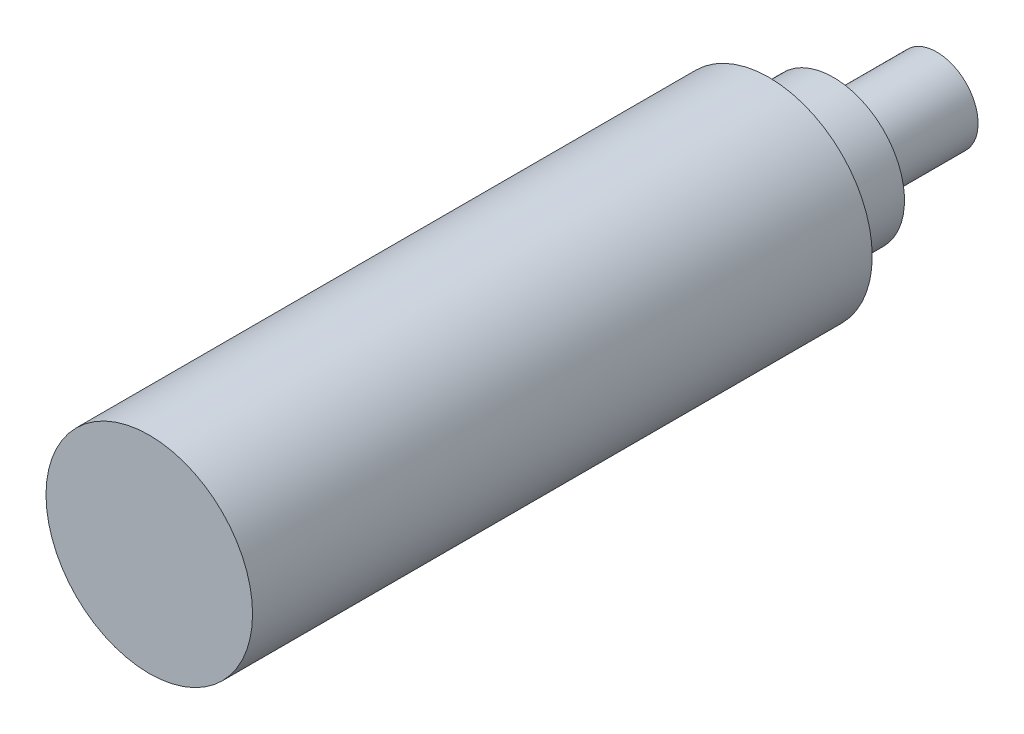
ISO-10303-21;
HEADER;
FILE_DESCRIPTION(('STEP AP214'),'2;1');
FILE_NAME('part.step','',(''),(''),'','','');
FILE_SCHEMA(('AUTOMOTIVE_DESIGN { 1 0 10303 214 1 1 1 1 }'));
ENDSEC;
DATA;
#1=APPLICATION_CONTEXT('core data for automotive mechanical design processes');
#2=APPLICATION_PROTOCOL_DEFINITION('international standard','automotive_design',2000,#1);
#3=PRODUCT_CONTEXT('',#1,'mechanical');
#4=PRODUCT('Part','Part','',(#3));
#5=PRODUCT_RELATED_PRODUCT_CATEGORY('part','',(#4));
#6=PRODUCT_DEFINITION_FORMATION('','',#4);
#7=PRODUCT_DEFINITION_CONTEXT('part definition',#1,'design');
#8=PRODUCT_DEFINITION('design','',#6,#7);
#9=PRODUCT_DEFINITION_SHAPE('','',#8);
#10=(LENGTH_UNIT() NAMED_UNIT(*) SI_UNIT(.MILLI.,.METRE.));
#11=(NAMED_UNIT(*) PLANE_ANGLE_UNIT() SI_UNIT($,.RADIAN.));
#12=(NAMED_UNIT(*) SI_UNIT($,.STERADIAN.) SOLID_ANGLE_UNIT());
#13=UNCERTAINTY_MEASURE_WITH_UNIT(LENGTH_MEASURE(1.E-05),#10,'distance_accuracy_value','');
#14=(GEOMETRIC_REPRESENTATION_CONTEXT(3) GLOBAL_UNCERTAINTY_ASSIGNED_CONTEXT((#13)) GLOBAL_UNIT_ASSIGNED_CONTEXT((#10,
#11,#12)) REPRESENTATION_CONTEXT('',''));
#15=CARTESIAN_POINT('',(0.,0.,0.));
#16=DIRECTION('',(0.,0.,1.));
#17=DIRECTION('',(1.,0.,0.));
#18=AXIS2_PLACEMENT_3D('',#15,#16,#17);
#19=CARTESIAN_POINT('',(0.,0.,24.));
#20=DIRECTION('',(0.,0.,-1.));
#21=DIRECTION('',(-1.,0.,0.));
#22=AXIS2_PLACEMENT_3D('',#19,#20,#21);
#23=CYLINDRICAL_SURFACE('',#22,4.);
#24=CARTESIAN_POINT('',(0.,0.,24.));
#25=DIRECTION('',(0.,0.,1.));
#26=DIRECTION('',(1.,0.,0.));
#27=AXIS2_PLACEMENT_3D('',#24,#25,#26);
#28=CIRCLE('',#27,4.);
#29=CARTESIAN_POINT('',(4.,0.,24.));
#30=VERTEX_POINT('',#29);
#31=EDGE_CURVE('E55',#30,#30,#28,.T.);
#32=ORIENTED_EDGE('',*,*,#31,.F.);
#33=EDGE_LOOP('',(#32));
#34=FACE_BOUND('',#33,.T.);
#35=CARTESIAN_POINT('',(0.,0.,0.));
#36=DIRECTION('',(0.,0.,1.));
#37=DIRECTION('',(1.,0.,0.));
#38=AXIS2_PLACEMENT_3D('',#35,#36,#37);
#39=CIRCLE('',#38,4.);
#40=CARTESIAN_POINT('',(4.,0.,0.));
#41=VERTEX_POINT('',#40);
#42=EDGE_CURVE('E34',#41,#41,#39,.T.);
#43=ORIENTED_EDGE('',*,*,#42,.T.);
#44=EDGE_LOOP('',(#43));
#45=FACE_BOUND('',#44,.T.);
#46=ADVANCED_FACE('F31',(#34,#45),#23,.T.);
#47=CARTESIAN_POINT('',(0.,0.,24.));
#48=DIRECTION('',(0.,0.,1.));
#49=DIRECTION('',(1.,0.,0.));
#50=AXIS2_PLACEMENT_3D('',#47,#48,#49);
#51=PLANE('',#50);
#52=ORIENTED_EDGE('',*,*,#31,.T.);
#53=EDGE_LOOP('',(#52));
#54=FACE_BOUND('',#53,.T.);
#55=ADVANCED_FACE('F66',(#54),#51,.T.);
#56=CARTESIAN_POINT('',(0.,0.,0.));
#57=DIRECTION('',(0.,0.,1.));
#58=DIRECTION('',(1.,0.,0.));
#59=AXIS2_PLACEMENT_3D('',#56,#57,#58);
#60=PLANE('',#59);
#61=CARTESIAN_POINT('',(0.,0.,0.));
#62=DIRECTION('',(0.,0.,-1.));
#63=DIRECTION('',(-1.,0.,0.));
#64=AXIS2_PLACEMENT_3D('',#61,#62,#63);
#65=CIRCLE('',#64,3.);
#66=CARTESIAN_POINT('',(-3.,0.,0.));
#67=VERTEX_POINT('',#66);
#68=EDGE_CURVE('E43',#67,#67,#65,.T.);
#69=ORIENTED_EDGE('',*,*,#68,.F.);
#70=EDGE_LOOP('',(#69));
#71=FACE_BOUND('',#70,.T.);
#72=ORIENTED_EDGE('',*,*,#42,.F.);
#73=EDGE_LOOP('',(#72));
#74=FACE_BOUND('',#73,.T.);
#75=ADVANCED_FACE('F63',(#71,#74),#60,.F.);
#76=CARTESIAN_POINT('',(0.,0.,-0.5));
#77=DIRECTION('',(0.,0.,1.));
#78=DIRECTION('',(1.,0.,0.));
#79=AXIS2_PLACEMENT_3D('',#76,#77,#78);
#80=CYLINDRICAL_SURFACE('',#79,3.);
#81=CARTESIAN_POINT('',(0.,0.,-0.5));
#82=DIRECTION('',(0.,0.,-1.));
#83=DIRECTION('',(-1.,0.,0.));
#84=AXIS2_PLACEMENT_3D('',#81,#82,#83);
#85=CIRCLE('',#84,3.);
#86=CARTESIAN_POINT('',(-3.,0.,-0.5));
#87=VERTEX_POINT('',#86);
#88=EDGE_CURVE('E50',#87,#87,#85,.T.);
#89=ORIENTED_EDGE('',*,*,#88,.F.);
#90=EDGE_LOOP('',(#89));
#91=FACE_BOUND('',#90,.T.);
#92=ORIENTED_EDGE('',*,*,#68,.T.);
#93=EDGE_LOOP('',(#92));
#94=FACE_BOUND('',#93,.T.);
#95=ADVANCED_FACE('F65',(#91,#94),#80,.T.);
#96=CARTESIAN_POINT('',(0.,0.,-0.5));
#97=DIRECTION('',(0.,0.,-1.));
#98=DIRECTION('',(-1.,0.,0.));
#99=AXIS2_PLACEMENT_3D('',#96,#97,#98);
#100=PLANE('',#99);
#101=CARTESIAN_POINT('',(0.,0.,-0.5));
#102=DIRECTION('',(0.,0.,-1.));
#103=DIRECTION('',(-1.,0.,0.));
#104=AXIS2_PLACEMENT_3D('',#101,#102,#103);
#105=CIRCLE('',#104,2.75);
#106=CARTESIAN_POINT('',(-2.75,0.,-0.5));
#107=VERTEX_POINT('',#106);
#108=EDGE_CURVE('E38',#107,#107,#105,.T.);
#109=ORIENTED_EDGE('',*,*,#108,.F.);
#110=EDGE_LOOP('',(#109));
#111=FACE_BOUND('',#110,.T.);
#112=ORIENTED_EDGE('',*,*,#88,.T.);
#113=EDGE_LOOP('',(#112));
#114=FACE_BOUND('',#113,.T.);
#115=ADVANCED_FACE('F73',(#111,#114),#100,.T.);
#116=CARTESIAN_POINT('',(0.,0.,-2.5));
#117=DIRECTION('',(0.,0.,1.));
#118=DIRECTION('',(1.,0.,0.));
#119=AXIS2_PLACEMENT_3D('',#116,#117,#118);
#120=CYLINDRICAL_SURFACE('',#119,2.75);
#121=CARTESIAN_POINT('',(0.,0.,-2.5));
#122=DIRECTION('',(0.,0.,-1.));
#123=DIRECTION('',(-1.,0.,0.));
#124=AXIS2_PLACEMENT_3D('',#121,#122,#123);
#125=CIRCLE('',#124,2.75);
#126=CARTESIAN_POINT('',(-2.75,0.,-2.5));
#127=VERTEX_POINT('',#126);
#128=EDGE_CURVE('E48',#127,#127,#125,.T.);
#129=ORIENTED_EDGE('',*,*,#128,.F.);
#130=EDGE_LOOP('',(#129));
#131=FACE_BOUND('',#130,.T.);
#132=ORIENTED_EDGE('',*,*,#108,.T.);
#133=EDGE_LOOP('',(#132));
#134=FACE_BOUND('',#133,.T.);
#135=ADVANCED_FACE('F99',(#131,#134),#120,.T.);
#136=CARTESIAN_POINT('',(0.,0.,-2.5));
#137=DIRECTION('',(0.,0.,-1.));
#138=DIRECTION('',(-1.,0.,0.));
#139=AXIS2_PLACEMENT_3D('',#136,#137,#138);
#140=PLANE('',#139);
#141=CARTESIAN_POINT('',(0.,0.,-2.5));
#142=DIRECTION('',(0.,0.,-1.));
#143=DIRECTION('',(-1.,0.,0.));
#144=AXIS2_PLACEMENT_3D('',#141,#142,#143);
#145=CIRCLE('',#144,1.6);
#146=CARTESIAN_POINT('',(-1.6,0.,-2.5));
#147=VERTEX_POINT('',#146);
#148=EDGE_CURVE('E10',#147,#147,#145,.T.);
#149=ORIENTED_EDGE('',*,*,#148,.F.);
#150=EDGE_LOOP('',(#149));
#151=FACE_BOUND('',#150,.T.);
#152=ORIENTED_EDGE('',*,*,#128,.T.);
#153=EDGE_LOOP('',(#152));
#154=FACE_BOUND('',#153,.T.);
#155=ADVANCED_FACE('F107',(#151,#154),#140,.T.);
#156=CARTESIAN_POINT('',(0.,0.,-6.5));
#157=DIRECTION('',(0.,0.,1.));
#158=DIRECTION('',(1.,0.,0.));
#159=AXIS2_PLACEMENT_3D('',#156,#157,#158);
#160=CYLINDRICAL_SURFACE('',#159,1.6);
#161=CARTESIAN_POINT('',(0.,0.,-6.5));
#162=DIRECTION('',(0.,0.,-1.));
#163=DIRECTION('',(-1.,0.,0.));
#164=AXIS2_PLACEMENT_3D('',#161,#162,#163);
#165=CIRCLE('',#164,1.6);
#166=CARTESIAN_POINT('',(-1.6,0.,-6.5));
#167=VERTEX_POINT('',#166);
#168=EDGE_CURVE('E47',#167,#167,#165,.T.);
#169=ORIENTED_EDGE('',*,*,#168,.F.);
#170=EDGE_LOOP('',(#169));
#171=FACE_BOUND('',#170,.T.);
#172=ORIENTED_EDGE('',*,*,#148,.T.);
#173=EDGE_LOOP('',(#172));
#174=FACE_BOUND('',#173,.T.);
#175=ADVANCED_FACE('F115',(#171,#174),#160,.T.);
#176=CARTESIAN_POINT('',(0.,0.,-6.5));
#177=DIRECTION('',(0.,0.,-1.));
#178=DIRECTION('',(-1.,0.,0.));
#179=AXIS2_PLACEMENT_3D('',#176,#177,#178);
#180=PLANE('',#179);
#181=ORIENTED_EDGE('',*,*,#168,.T.);
#182=EDGE_LOOP('',(#181));
#183=FACE_BOUND('',#182,.T.);
#184=ADVANCED_FACE('F123',(#183),#180,.T.);
#185=CLOSED_SHELL('',(#46,#55,#75,#95,#115,#135,#155,#175,#184));
#186=MANIFOLD_SOLID_BREP('B2',#185);
#187=ADVANCED_BREP_SHAPE_REPRESENTATION('',(#18,#186),#14);
#188=SHAPE_DEFINITION_REPRESENTATION(#9,#187);
ENDSEC;
END-ISO-10303-21;
